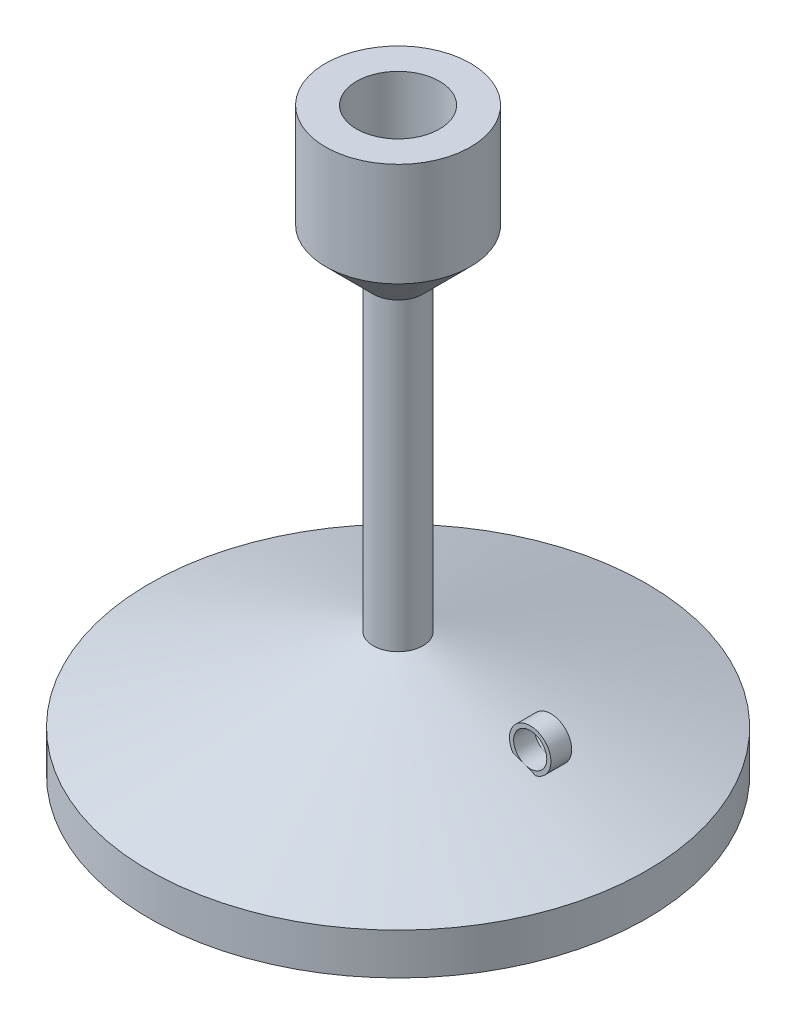
ISO-10303-21;
HEADER;
FILE_DESCRIPTION(('STEP AP214'),'2;1');
FILE_NAME('part.step','',(''),(''),'','','');
FILE_SCHEMA(('AUTOMOTIVE_DESIGN { 1 0 10303 214 1 1 1 1 }'));
ENDSEC;
DATA;
#1=APPLICATION_CONTEXT('core data for automotive mechanical design processes');
#2=APPLICATION_PROTOCOL_DEFINITION('international standard','automotive_design',2000,#1);
#3=PRODUCT_CONTEXT('',#1,'mechanical');
#4=PRODUCT('Part','Part','',(#3));
#5=PRODUCT_RELATED_PRODUCT_CATEGORY('part','',(#4));
#6=PRODUCT_DEFINITION_FORMATION('','',#4);
#7=PRODUCT_DEFINITION_CONTEXT('part definition',#1,'design');
#8=PRODUCT_DEFINITION('design','',#6,#7);
#9=PRODUCT_DEFINITION_SHAPE('','',#8);
#10=(LENGTH_UNIT() NAMED_UNIT(*) SI_UNIT(.MILLI.,.METRE.));
#11=(NAMED_UNIT(*) PLANE_ANGLE_UNIT() SI_UNIT($,.RADIAN.));
#12=(NAMED_UNIT(*) SI_UNIT($,.STERADIAN.) SOLID_ANGLE_UNIT());
#13=UNCERTAINTY_MEASURE_WITH_UNIT(LENGTH_MEASURE(1.E-05),#10,'distance_accuracy_value','');
#14=(GEOMETRIC_REPRESENTATION_CONTEXT(3) GLOBAL_UNCERTAINTY_ASSIGNED_CONTEXT((#13)) GLOBAL_UNIT_ASSIGNED_CONTEXT((#10,
#11,#12)) REPRESENTATION_CONTEXT('',''));
#15=CARTESIAN_POINT('',(0.,0.,0.));
#16=DIRECTION('',(0.,0.,1.));
#17=DIRECTION('',(1.,0.,0.));
#18=AXIS2_PLACEMENT_3D('',#15,#16,#17);
#19=CARTESIAN_POINT('',(0.,30.,0.));
#20=DIRECTION('',(0.,-1.,0.));
#21=DIRECTION('',(0.,0.,-1.));
#22=AXIS2_PLACEMENT_3D('',#19,#20,#21);
#23=CONICAL_SURFACE('',#22,5.99999999999999,1.21609067478396);
#24=CARTESIAN_POINT('',(0.,30.,0.));
#25=DIRECTION('',(0.,-1.,0.));
#26=DIRECTION('',(0.,0.,-1.));
#27=AXIS2_PLACEMENT_3D('',#24,#25,#26);
#28=CIRCLE('',#27,5.99999999999999);
#29=CARTESIAN_POINT('',(0.,30.,-5.99999999999999));
#30=VERTEX_POINT('',#29);
#31=EDGE_CURVE('E95',#30,#30,#28,.T.);
#32=ORIENTED_EDGE('',*,*,#31,.T.);
#33=EDGE_LOOP('',(#32));
#34=FACE_BOUND('',#33,.T.);
#35=CARTESIAN_POINT('',(0.,10.,0.));
#36=DIRECTION('',(0.,-1.,0.));
#37=DIRECTION('',(0.,0.,-1.));
#38=AXIS2_PLACEMENT_3D('',#35,#36,#37);
#39=CIRCLE('',#38,60.);
#40=CARTESIAN_POINT('',(0.,10.,-60.));
#41=VERTEX_POINT('',#40);
#42=EDGE_CURVE('E85',#41,#41,#39,.T.);
#43=ORIENTED_EDGE('',*,*,#42,.F.);
#44=EDGE_LOOP('',(#43));
#45=FACE_BOUND('',#44,.T.);
#46=CARTESIAN_POINT('',(35.7426556307296,18.9376476326084,3.0002));
#47=CARTESIAN_POINT('',(35.7663947245855,18.9443712322931,2.50041962891161));
#48=CARTESIAN_POINT('',(35.7840458527664,18.9494746011026,2.00033703980137));
#49=CARTESIAN_POINT('',(35.8074680750077,18.9563164438835,1.00016951312472));
#50=CARTESIAN_POINT('',(35.813246282171,18.9580569325292,0.50008475656236));
#51=CARTESIAN_POINT('',(35.813246282171,18.9580569325292,-0.500084756562362));
#52=CARTESIAN_POINT('',(35.8074680750077,18.9563164438835,-1.00016951312472));
#53=CARTESIAN_POINT('',(35.7840458527664,18.9494746011026,-2.00033703980137));
#54=CARTESIAN_POINT('',(35.7663947245855,18.9443712322931,-2.50041962891161));
#55=CARTESIAN_POINT('',(35.7426556307296,18.9376476326084,-3.0002));
#56=B_SPLINE_CURVE_WITH_KNOTS('',3,(#46,#47,#48,#49,#50,#51,#52,#53,#54,#55),.UNSPECIFIED.,.F.,
.F.,(4,2,2,2,4),(0.,1.50111375392325,3.00132792352058,4.50154209311792,6.00265584704117),.UNSPECIFIED.);
#57=CARTESIAN_POINT('',(35.764416615344,18.9438194483792,2.5));
#58=VERTEX_POINT('',#57);
#59=CARTESIAN_POINT('',(35.764416615344,18.9438194483792,-2.5));
#60=VERTEX_POINT('',#59);
#61=EDGE_CURVE('E11',#58,#60,#56,.T.);
#62=ORIENTED_EDGE('',*,*,#61,.F.);
#63=CARTESIAN_POINT('',(53.5315930470252,12.3740970394267,2.5));
#64=CARTESIAN_POINT('',(51.9369165113548,12.9640718220263,2.5));
#65=CARTESIAN_POINT('',(50.3422232261098,13.5540013433452,2.5));
#66=CARTESIAN_POINT('',(47.1527868708398,14.7337254734884,2.5));
#67=CARTESIAN_POINT('',(45.5580438008179,15.3235200823213,2.5));
#68=CARTESIAN_POINT('',(42.3684921529479,16.5029297895829,2.5));
#69=CARTESIAN_POINT('',(40.7736835751317,17.0925448880978,2.5));
#70=CARTESIAN_POINT('',(37.5839727641636,18.2715220679454,2.5));
#71=CARTESIAN_POINT('',(35.9890705310051,18.8608841492601,2.5));
#72=CARTESIAN_POINT('',(32.7991271938777,20.0392360166755,2.5));
#73=CARTESIAN_POINT('',(31.2040860898069,20.6282258025005,2.5));
#74=CARTESIAN_POINT('',(28.0137919467539,21.8056304704898,2.5));
#75=CARTESIAN_POINT('',(26.4185389078065,22.3940453527487,2.5));
#76=CARTESIAN_POINT('',(24.0253882505421,23.2759338272828,2.5));
#77=CARTESIAN_POINT('',(23.2276258977296,23.5697744484123,2.5));
#78=CARTESIAN_POINT('',(21.6319770206921,24.1571181524416,2.5));
#79=CARTESIAN_POINT('',(20.8340904964779,24.450621235371,2.5));
#80=CARTESIAN_POINT('',(19.2381478500259,25.037167561459,2.5));
#81=CARTESIAN_POINT('',(18.4400917276907,25.3302108043528,2.5));
#82=CARTESIAN_POINT('',(16.8437219199073,25.9155955514,2.5));
#83=CARTESIAN_POINT('',(16.0454082343802,26.2079370553384,2.5));
#84=CARTESIAN_POINT('',(15.2469217995636,26.4998067351107,2.5));
#85=B_SPLINE_CURVE_WITH_KNOTS('',3,(#63,#64,#65,#66,#67,#68,#69,#70,#71,#72,#73,#74,#75,#76,#77,
#78,#79,#80,#81,#82,#83,#84),.UNSPECIFIED.,.F.,.F.,(4,2,2,2,2,2,2,2,2,2,4),(0.,5.10093829961601,
10.2018762711705,15.3028117872131,20.4037476641277,25.5046873122539,30.605626120041,
33.1560973390106,35.7065683349532,38.2570407995799,40.8075140457519),.UNSPECIFIED.);
#86=CARTESIAN_POINT('',(30.2196979893004,20.9915070240059,2.5));
#87=VERTEX_POINT('',#86);
#88=EDGE_CURVE('E51',#58,#87,#85,.T.);
#89=ORIENTED_EDGE('',*,*,#88,.T.);
#90=CARTESIAN_POINT('',(30.2345073981663,20.9692595722403,-3.0002));
#91=CARTESIAN_POINT('',(30.2263902078938,20.9813896785962,-2.75036027730127));
#92=CARTESIAN_POINT('',(30.2193599723096,20.991997633546,-2.50041547442269));
#93=CARTESIAN_POINT('',(30.2073877534334,21.010175549757,-2.00036681474272));
#94=CARTESIAN_POINT('',(30.2024457574809,21.0177455294368,-1.75026295891484));
#95=CARTESIAN_POINT('',(30.1906303210953,21.0358977102232,-1.00021679157492));
#96=CARTESIAN_POINT('',(30.1867537178289,21.0419430674708,-0.500108395787461));
#97=CARTESIAN_POINT('',(30.1867537178289,21.0419430674708,0.500108395787462));
#98=CARTESIAN_POINT('',(30.1906303210953,21.0358977102232,1.00021679157492));
#99=CARTESIAN_POINT('',(30.2024457574809,21.0177455294368,1.75026295891484));
#100=CARTESIAN_POINT('',(30.2073877534334,21.010175549757,2.00036681474272));
#101=CARTESIAN_POINT('',(30.2193599723096,20.991997633546,2.50041547442269));
#102=CARTESIAN_POINT('',(30.2263902078938,20.9813896785962,2.75036027730127));
#103=CARTESIAN_POINT('',(30.2345073981663,20.9692595722403,3.0002));
#104=B_SPLINE_CURVE_WITH_KNOTS('',3,(#90,#91,#92,#93,#94,#95,#96,#97,#98,#99,#100,#101,#102,
#103),.UNSPECIFIED.,.F.,.F.,(4,2,2,2,2,2,4),(0.,0.750782288203038,1.50156002449202,
3.00181937737705,4.50207873026207,5.25285646655106,6.0036387547541),.UNSPECIFIED.);
#105=CARTESIAN_POINT('',(30.2196979893004,20.9915070240059,-2.5));
#106=VERTEX_POINT('',#105);
#107=EDGE_CURVE('E69',#106,#87,#104,.T.);
#108=ORIENTED_EDGE('',*,*,#107,.F.);
#109=CARTESIAN_POINT('',(53.5315930470252,12.3740970394267,-2.5));
#110=CARTESIAN_POINT('',(51.9369165113548,12.9640718220263,-2.5));
#111=CARTESIAN_POINT('',(50.3422232261098,13.5540013433452,-2.5));
#112=CARTESIAN_POINT('',(47.1527868708398,14.7337254734884,-2.5));
#113=CARTESIAN_POINT('',(45.5580438008179,15.3235200823213,-2.5));
#114=CARTESIAN_POINT('',(42.3684921529479,16.5029297895829,-2.5));
#115=CARTESIAN_POINT('',(40.7736835751317,17.0925448880978,-2.5));
#116=CARTESIAN_POINT('',(37.5839727641636,18.2715220679454,-2.5));
#117=CARTESIAN_POINT('',(35.9890705310051,18.8608841492601,-2.5));
#118=CARTESIAN_POINT('',(32.7991271938777,20.0392360166755,-2.5));
#119=CARTESIAN_POINT('',(31.2040860898069,20.6282258025005,-2.5));
#120=CARTESIAN_POINT('',(28.0137919467539,21.8056304704898,-2.5));
#121=CARTESIAN_POINT('',(26.4185389078065,22.3940453527487,-2.5));
#122=CARTESIAN_POINT('',(24.0253882505421,23.2759338272828,-2.5));
#123=CARTESIAN_POINT('',(23.2276258977296,23.5697744484123,-2.5));
#124=CARTESIAN_POINT('',(21.6319770206921,24.1571181524416,-2.5));
#125=CARTESIAN_POINT('',(20.8340904964779,24.450621235371,-2.5));
#126=CARTESIAN_POINT('',(19.2381478500259,25.037167561459,-2.5));
#127=CARTESIAN_POINT('',(18.4400917276907,25.3302108043528,-2.5));
#128=CARTESIAN_POINT('',(16.8437219199073,25.9155955514,-2.5));
#129=CARTESIAN_POINT('',(16.0454082343802,26.2079370553384,-2.5));
#130=CARTESIAN_POINT('',(15.2469217995636,26.4998067351107,-2.5));
#131=B_SPLINE_CURVE_WITH_KNOTS('',3,(#109,#110,#111,#112,#113,#114,#115,#116,#117,#118,#119,
#120,#121,#122,#123,#124,#125,#126,#127,#128,#129,#130),.UNSPECIFIED.,.F.,.F.,(4,2,2,2,2,2,2,2,
2,2,4),(0.,5.10093829961601,10.2018762711705,15.3028117872131,20.4037476641277,25.5046873122539,
30.605626120041,33.1560973390106,35.7065683349532,38.2570407995799,40.8075140457519),.UNSPECIFIED.);
#132=EDGE_CURVE('E61',#60,#106,#131,.T.);
#133=ORIENTED_EDGE('',*,*,#132,.F.);
#134=EDGE_LOOP('',(#62,#89,#108,#133));
#135=FACE_BOUND('',#134,.T.);
#136=ADVANCED_FACE('F37',(#34,#45,#135),#23,.T.);
#137=CARTESIAN_POINT('',(0.,120.,0.));
#138=DIRECTION('',(0.,-1.,0.));
#139=DIRECTION('',(0.,0.,-1.));
#140=AXIS2_PLACEMENT_3D('',#137,#138,#139);
#141=PLANE('',#140);
#142=CARTESIAN_POINT('',(0.,120.,0.));
#143=DIRECTION('',(0.,-1.,0.));
#144=DIRECTION('',(0.,0.,-1.));
#145=AXIS2_PLACEMENT_3D('',#142,#143,#144);
#146=CIRCLE('',#145,10.);
#147=CARTESIAN_POINT('',(0.,120.,-10.));
#148=VERTEX_POINT('',#147);
#149=EDGE_CURVE('E79',#148,#148,#146,.T.);
#150=ORIENTED_EDGE('',*,*,#149,.F.);
#151=EDGE_LOOP('',(#150));
#152=FACE_BOUND('',#151,.T.);
#153=ADVANCED_FACE('F39',(#152),#141,.F.);
#154=CARTESIAN_POINT('',(0.,0.,0.));
#155=DIRECTION('',(0.,-1.,0.));
#156=DIRECTION('',(0.,0.,-1.));
#157=AXIS2_PLACEMENT_3D('',#154,#155,#156);
#158=CYLINDRICAL_SURFACE('',#157,10.);
#159=CARTESIAN_POINT('',(0.,140.,0.));
#160=DIRECTION('',(0.,-1.,0.));
#161=DIRECTION('',(0.,0.,-1.));
#162=AXIS2_PLACEMENT_3D('',#159,#160,#161);
#163=CIRCLE('',#162,10.);
#164=CARTESIAN_POINT('',(0.,140.,-10.));
#165=VERTEX_POINT('',#164);
#166=EDGE_CURVE('E107',#165,#165,#163,.T.);
#167=ORIENTED_EDGE('',*,*,#166,.F.);
#168=EDGE_LOOP('',(#167));
#169=FACE_BOUND('',#168,.T.);
#170=ORIENTED_EDGE('',*,*,#149,.T.);
#171=EDGE_LOOP('',(#170));
#172=FACE_BOUND('',#171,.T.);
#173=ADVANCED_FACE('F151',(#169,#172),#158,.F.);
#174=CARTESIAN_POINT('',(-10.,140.,0.));
#175=DIRECTION('',(0.,-1.,0.));
#176=DIRECTION('',(0.,0.,-1.));
#177=AXIS2_PLACEMENT_3D('',#174,#175,#176);
#178=PLANE('',#177);
#179=CARTESIAN_POINT('',(0.,140.,0.));
#180=DIRECTION('',(0.,-1.,0.));
#181=DIRECTION('',(0.,0.,-1.));
#182=AXIS2_PLACEMENT_3D('',#179,#180,#181);
#183=CIRCLE('',#182,17.5);
#184=CARTESIAN_POINT('',(0.,140.,-17.5));
#185=VERTEX_POINT('',#184);
#186=EDGE_CURVE('E104',#185,#185,#183,.T.);
#187=ORIENTED_EDGE('',*,*,#186,.F.);
#188=EDGE_LOOP('',(#187));
#189=FACE_BOUND('',#188,.T.);
#190=ORIENTED_EDGE('',*,*,#166,.T.);
#191=EDGE_LOOP('',(#190));
#192=FACE_BOUND('',#191,.T.);
#193=ADVANCED_FACE('F167',(#189,#192),#178,.F.);
#194=CARTESIAN_POINT('',(0.,0.,0.));
#195=DIRECTION('',(0.,-1.,0.));
#196=DIRECTION('',(0.,0.,-1.));
#197=AXIS2_PLACEMENT_3D('',#194,#195,#196);
#198=CYLINDRICAL_SURFACE('',#197,17.5);
#199=CARTESIAN_POINT('',(0.,115.,0.));
#200=DIRECTION('',(0.,-1.,0.));
#201=DIRECTION('',(0.,0.,-1.));
#202=AXIS2_PLACEMENT_3D('',#199,#200,#201);
#203=CIRCLE('',#202,17.5);
#204=CARTESIAN_POINT('',(0.,115.,-17.5));
#205=VERTEX_POINT('',#204);
#206=EDGE_CURVE('E101',#205,#205,#203,.T.);
#207=ORIENTED_EDGE('',*,*,#206,.F.);
#208=EDGE_LOOP('',(#207));
#209=FACE_BOUND('',#208,.T.);
#210=ORIENTED_EDGE('',*,*,#186,.T.);
#211=EDGE_LOOP('',(#210));
#212=FACE_BOUND('',#211,.T.);
#213=ADVANCED_FACE('F161',(#209,#212),#198,.T.);
#214=CARTESIAN_POINT('',(0.,115.,0.));
#215=DIRECTION('',(0.,1.,0.));
#216=DIRECTION('',(0.,0.,1.));
#217=AXIS2_PLACEMENT_3D('',#214,#215,#216);
#218=CONICAL_SURFACE('',#217,17.5,0.785398163397444);
#219=CARTESIAN_POINT('',(0.,103.5,0.));
#220=DIRECTION('',(0.,-1.,0.));
#221=DIRECTION('',(0.,0.,-1.));
#222=AXIS2_PLACEMENT_3D('',#219,#220,#221);
#223=CIRCLE('',#222,6.);
#224=CARTESIAN_POINT('',(0.,103.5,-6.));
#225=VERTEX_POINT('',#224);
#226=EDGE_CURVE('E98',#225,#225,#223,.T.);
#227=ORIENTED_EDGE('',*,*,#226,.F.);
#228=EDGE_LOOP('',(#227));
#229=FACE_BOUND('',#228,.T.);
#230=ORIENTED_EDGE('',*,*,#206,.T.);
#231=EDGE_LOOP('',(#230));
#232=FACE_BOUND('',#231,.T.);
#233=ADVANCED_FACE('F142',(#229,#232),#218,.T.);
#234=CARTESIAN_POINT('',(0.,0.,0.));
#235=DIRECTION('',(0.,-1.,0.));
#236=DIRECTION('',(0.,0.,-1.));
#237=AXIS2_PLACEMENT_3D('',#234,#235,#236);
#238=CYLINDRICAL_SURFACE('',#237,6.);
#239=ORIENTED_EDGE('',*,*,#31,.F.);
#240=EDGE_LOOP('',(#239));
#241=FACE_BOUND('',#240,.T.);
#242=ORIENTED_EDGE('',*,*,#226,.T.);
#243=EDGE_LOOP('',(#242));
#244=FACE_BOUND('',#243,.T.);
#245=ADVANCED_FACE('F137',(#241,#244),#238,.T.);
#246=CARTESIAN_POINT('',(0.,0.,0.));
#247=DIRECTION('',(0.,-1.,0.));
#248=DIRECTION('',(0.,0.,-1.));
#249=AXIS2_PLACEMENT_3D('',#246,#247,#248);
#250=CYLINDRICAL_SURFACE('',#249,60.);
#251=CARTESIAN_POINT('',(0.,0.,0.));
#252=DIRECTION('',(0.,-1.,0.));
#253=DIRECTION('',(0.,0.,-1.));
#254=AXIS2_PLACEMENT_3D('',#251,#252,#253);
#255=CIRCLE('',#254,60.);
#256=CARTESIAN_POINT('',(0.,0.,-60.));
#257=VERTEX_POINT('',#256);
#258=EDGE_CURVE('E82',#257,#257,#255,.T.);
#259=ORIENTED_EDGE('',*,*,#258,.F.);
#260=EDGE_LOOP('',(#259));
#261=FACE_BOUND('',#260,.T.);
#262=ORIENTED_EDGE('',*,*,#42,.T.);
#263=EDGE_LOOP('',(#262));
#264=FACE_BOUND('',#263,.T.);
#265=ADVANCED_FACE('F134',(#261,#264),#250,.T.);
#266=CARTESIAN_POINT('',(-60.,0.,0.));
#267=DIRECTION('',(0.,1.,0.));
#268=DIRECTION('',(0.,0.,1.));
#269=AXIS2_PLACEMENT_3D('',#266,#267,#268);
#270=PLANE('',#269);
#271=ORIENTED_EDGE('',*,*,#258,.T.);
#272=EDGE_LOOP('',(#271));
#273=FACE_BOUND('',#272,.T.);
#274=ADVANCED_FACE('F131',(#273),#270,.F.);
#275=CARTESIAN_POINT('',(34.3892574232944,23.7509950428948,2.5));
#276=DIRECTION('',(0.,0.,1.));
#277=DIRECTION('',(1.,0.,0.));
#278=AXIS2_PLACEMENT_3D('',#275,#276,#277);
#279=PLANE('',#278);
#280=CARTESIAN_POINT('',(34.3892574232944,23.7509950428948,2.5));
#281=DIRECTION('',(0.,0.,1.));
#282=DIRECTION('',(1.,0.,0.));
#283=AXIS2_PLACEMENT_3D('',#280,#281,#282);
#284=CIRCLE('',#283,3.99999999999996);
#285=CARTESIAN_POINT('',(38.3892574232943,23.7509950428948,2.5));
#286=VERTEX_POINT('',#285);
#287=EDGE_CURVE('E87',#286,#286,#284,.T.);
#288=ORIENTED_EDGE('',*,*,#287,.F.);
#289=EDGE_LOOP('',(#288));
#290=FACE_BOUND('',#289,.T.);
#291=ORIENTED_EDGE('',*,*,#88,.F.);
#292=CARTESIAN_POINT('',(34.3892574232944,23.7509950428948,2.5));
#293=DIRECTION('',(0.,0.,1.));
#294=DIRECTION('',(1.,0.,0.));
#295=AXIS2_PLACEMENT_3D('',#292,#293,#294);
#296=CIRCLE('',#295,4.99999999999996);
#297=EDGE_CURVE('E76',#58,#87,#296,.T.);
#298=ORIENTED_EDGE('',*,*,#297,.T.);
#299=EDGE_LOOP('',(#291,#298));
#300=FACE_BOUND('',#299,.T.);
#301=ADVANCED_FACE('F81',(#290,#300),#279,.T.);
#302=CARTESIAN_POINT('',(34.3892574232944,23.7509950428948,-2.5));
#303=DIRECTION('',(0.,0.,1.));
#304=DIRECTION('',(1.,0.,0.));
#305=AXIS2_PLACEMENT_3D('',#302,#303,#304);
#306=PLANE('',#305);
#307=CARTESIAN_POINT('',(34.3892574232944,23.7509950428948,-2.5));
#308=DIRECTION('',(0.,0.,1.));
#309=DIRECTION('',(1.,0.,0.));
#310=AXIS2_PLACEMENT_3D('',#307,#308,#309);
#311=CIRCLE('',#310,3.99999999999996);
#312=CARTESIAN_POINT('',(38.3892574232943,23.7509950428948,-2.5));
#313=VERTEX_POINT('',#312);
#314=EDGE_CURVE('E90',#313,#313,#311,.T.);
#315=ORIENTED_EDGE('',*,*,#314,.T.);
#316=EDGE_LOOP('',(#315));
#317=FACE_BOUND('',#316,.T.);
#318=CARTESIAN_POINT('',(34.3892574232944,23.7509950428948,-2.5));
#319=DIRECTION('',(0.,0.,1.));
#320=DIRECTION('',(1.,0.,0.));
#321=AXIS2_PLACEMENT_3D('',#318,#319,#320);
#322=CIRCLE('',#321,4.99999999999996);
#323=EDGE_CURVE('E78',#60,#106,#322,.T.);
#324=ORIENTED_EDGE('',*,*,#323,.F.);
#325=ORIENTED_EDGE('',*,*,#132,.T.);
#326=EDGE_LOOP('',(#324,#325));
#327=FACE_BOUND('',#326,.T.);
#328=ADVANCED_FACE('F128',(#317,#327),#306,.F.);
#329=CARTESIAN_POINT('',(34.3892574232944,23.7509950428948,2.5));
#330=DIRECTION('',(0.,0.,-1.));
#331=DIRECTION('',(-1.,0.,0.));
#332=AXIS2_PLACEMENT_3D('',#329,#330,#331);
#333=CYLINDRICAL_SURFACE('',#332,4.99999999999996);
#334=ORIENTED_EDGE('',*,*,#297,.F.);
#335=ORIENTED_EDGE('',*,*,#61,.T.);
#336=ORIENTED_EDGE('',*,*,#323,.T.);
#337=ORIENTED_EDGE('',*,*,#107,.T.);
#338=EDGE_LOOP('',(#334,#335,#336,#337));
#339=FACE_BOUND('',#338,.T.);
#340=ADVANCED_FACE('F75',(#339),#333,.T.);
#341=CARTESIAN_POINT('',(34.3892574232944,23.7509950428948,2.5));
#342=DIRECTION('',(0.,0.,-1.));
#343=DIRECTION('',(-1.,0.,0.));
#344=AXIS2_PLACEMENT_3D('',#341,#342,#343);
#345=CYLINDRICAL_SURFACE('',#344,3.99999999999996);
#346=CARTESIAN_POINT('',(33.,20.,0.));
#347=VERTEX_POINT('',#346);
#348=VERTEX_LOOP('',#347);
#349=FACE_BOUND('',#348,.T.);
#350=ORIENTED_EDGE('',*,*,#287,.T.);
#351=EDGE_LOOP('',(#350));
#352=FACE_BOUND('',#351,.T.);
#353=ORIENTED_EDGE('',*,*,#314,.F.);
#354=EDGE_LOOP('',(#353));
#355=FACE_BOUND('',#354,.T.);
#356=ADVANCED_FACE('F127',(#349,#352,#355),#345,.F.);
#357=CLOSED_SHELL('',(#136,#153,#173,#193,#213,#233,#245,#265,#274,#301,#328,#340,#356));
#358=MANIFOLD_SOLID_BREP('B2',#357);
#359=ADVANCED_BREP_SHAPE_REPRESENTATION('',(#18,#358),#14);
#360=SHAPE_DEFINITION_REPRESENTATION(#9,#359);
ENDSEC;
END-ISO-10303-21;
